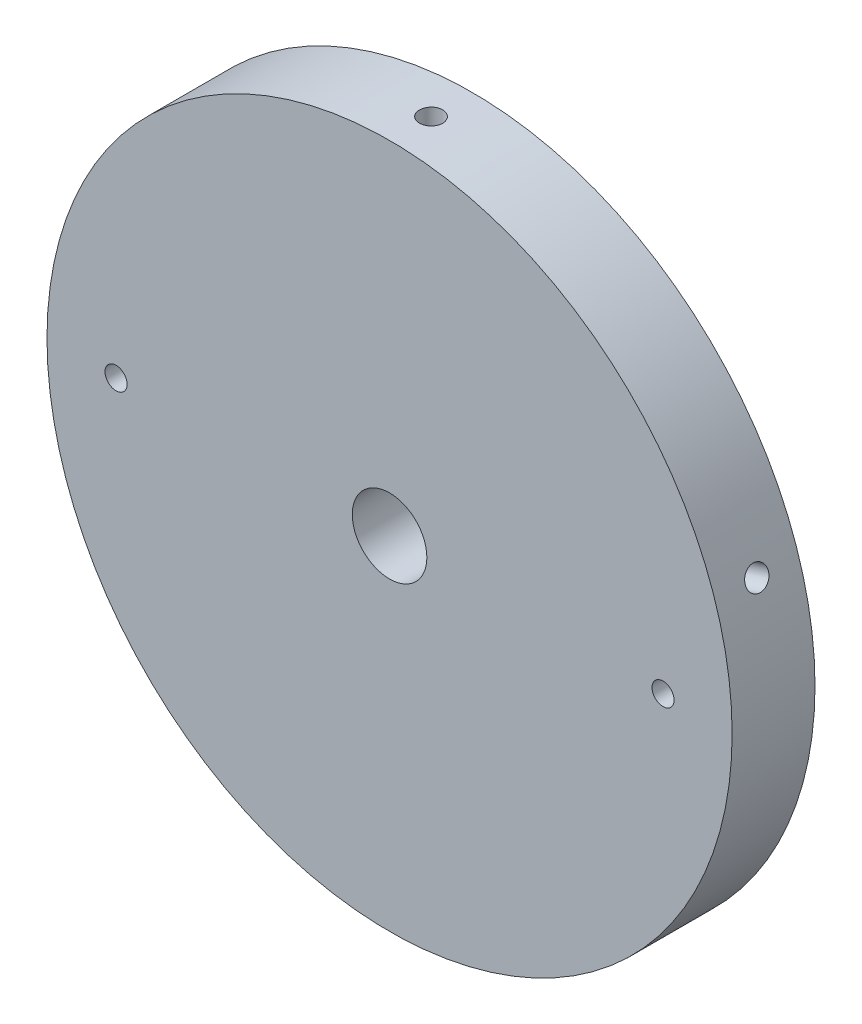
ISO-10303-21;
HEADER;
FILE_DESCRIPTION(('STEP AP214'),'2;1');
FILE_NAME('part.step','',(''),(''),'','','');
FILE_SCHEMA(('AUTOMOTIVE_DESIGN { 1 0 10303 214 1 1 1 1 }'));
ENDSEC;
DATA;
#1=APPLICATION_CONTEXT('core data for automotive mechanical design processes');
#2=APPLICATION_PROTOCOL_DEFINITION('international standard','automotive_design',2000,#1);
#3=PRODUCT_CONTEXT('',#1,'mechanical');
#4=PRODUCT('Part','Part','',(#3));
#5=PRODUCT_RELATED_PRODUCT_CATEGORY('part','',(#4));
#6=PRODUCT_DEFINITION_FORMATION('','',#4);
#7=PRODUCT_DEFINITION_CONTEXT('part definition',#1,'design');
#8=PRODUCT_DEFINITION('design','',#6,#7);
#9=PRODUCT_DEFINITION_SHAPE('','',#8);
#10=(LENGTH_UNIT() NAMED_UNIT(*) SI_UNIT(.MILLI.,.METRE.));
#11=(NAMED_UNIT(*) PLANE_ANGLE_UNIT() SI_UNIT($,.RADIAN.));
#12=(NAMED_UNIT(*) SI_UNIT($,.STERADIAN.) SOLID_ANGLE_UNIT());
#13=UNCERTAINTY_MEASURE_WITH_UNIT(LENGTH_MEASURE(1.E-05),#10,'distance_accuracy_value','');
#14=(GEOMETRIC_REPRESENTATION_CONTEXT(3) GLOBAL_UNCERTAINTY_ASSIGNED_CONTEXT((#13)) GLOBAL_UNIT_ASSIGNED_CONTEXT((#10,
#11,#12)) REPRESENTATION_CONTEXT('',''));
#15=CARTESIAN_POINT('',(0.,0.,0.));
#16=DIRECTION('',(0.,0.,1.));
#17=DIRECTION('',(1.,0.,0.));
#18=AXIS2_PLACEMENT_3D('',#15,#16,#17);
#19=CARTESIAN_POINT('',(0.,0.,0.));
#20=DIRECTION('',(0.,0.,1.));
#21=DIRECTION('',(1.,0.,0.));
#22=AXIS2_PLACEMENT_3D('',#19,#20,#21);
#23=PLANE('',#22);
#24=CARTESIAN_POINT('',(49.5,0.,0.));
#25=DIRECTION('',(0.,0.,-1.));
#26=DIRECTION('',(-1.,0.,0.));
#27=AXIS2_PLACEMENT_3D('',#24,#25,#26);
#28=CIRCLE('',#27,2.);
#29=CARTESIAN_POINT('',(47.5,0.,0.));
#30=VERTEX_POINT('',#29);
#31=EDGE_CURVE('E151',#30,#30,#28,.T.);
#32=ORIENTED_EDGE('',*,*,#31,.F.);
#33=EDGE_LOOP('',(#32));
#34=FACE_BOUND('',#33,.T.);
#35=CARTESIAN_POINT('',(-49.5,0.,0.));
#36=DIRECTION('',(0.,0.,-1.));
#37=DIRECTION('',(1.,0.,0.));
#38=AXIS2_PLACEMENT_3D('',#35,#36,#37);
#39=CIRCLE('',#38,2.);
#40=CARTESIAN_POINT('',(-47.5,0.,0.));
#41=VERTEX_POINT('',#40);
#42=EDGE_CURVE('E88',#41,#41,#39,.T.);
#43=ORIENTED_EDGE('',*,*,#42,.F.);
#44=EDGE_LOOP('',(#43));
#45=FACE_BOUND('',#44,.T.);
#46=CARTESIAN_POINT('',(0.,0.,0.));
#47=DIRECTION('',(0.,0.,1.));
#48=DIRECTION('',(1.,0.,0.));
#49=AXIS2_PLACEMENT_3D('',#46,#47,#48);
#50=CIRCLE('',#49,62.);
#51=CARTESIAN_POINT('',(62.,0.,0.));
#52=VERTEX_POINT('',#51);
#53=EDGE_CURVE('E105',#52,#52,#50,.T.);
#54=ORIENTED_EDGE('',*,*,#53,.F.);
#55=EDGE_LOOP('',(#54));
#56=FACE_BOUND('',#55,.T.);
#57=CARTESIAN_POINT('',(0.,0.,0.));
#58=DIRECTION('',(0.,0.,-1.));
#59=DIRECTION('',(-1.,0.,0.));
#60=AXIS2_PLACEMENT_3D('',#57,#58,#59);
#61=CIRCLE('',#60,6.75);
#62=CARTESIAN_POINT('',(-6.75,0.,0.));
#63=VERTEX_POINT('',#62);
#64=EDGE_CURVE('E99',#63,#63,#61,.T.);
#65=ORIENTED_EDGE('',*,*,#64,.F.);
#66=EDGE_LOOP('',(#65));
#67=FACE_BOUND('',#66,.T.);
#68=ADVANCED_FACE('F43',(#34,#45,#56,#67),#23,.F.);
#69=CARTESIAN_POINT('',(0.,0.,15.));
#70=DIRECTION('',(0.,0.,-1.));
#71=DIRECTION('',(-1.,0.,0.));
#72=AXIS2_PLACEMENT_3D('',#69,#70,#71);
#73=CYLINDRICAL_SURFACE('',#72,62.);
#74=CARTESIAN_POINT('',(0.,62.,9.59999999999999));
#75=CARTESIAN_POINT('',(-0.117921638843177,61.9999995213604,9.5999947818121));
#76=CARTESIAN_POINT('',(-0.235927920803326,61.999659968179,9.59003414813732));
#77=CARTESIAN_POINT('',(-0.468688041985538,61.9983380658244,9.55043882006453));
#78=CARTESIAN_POINT('',(-0.583437834106351,61.9973549504634,9.52078067433379));
#79=CARTESIAN_POINT('',(-0.806279343525078,61.9948572492048,9.44263782182455));
#80=CARTESIAN_POINT('',(-0.914374308653767,61.9933429250153,9.39416238441721));
#81=CARTESIAN_POINT('',(-1.12086235079248,61.9899535779122,9.27977443318435));
#82=CARTESIAN_POINT('',(-1.21925777611183,61.9880786426304,9.21386615424374));
#83=CARTESIAN_POINT('',(-1.40363707403613,61.9841780224041,9.06644215555477));
#84=CARTESIAN_POINT('',(-1.48961518388586,61.9821522681226,8.9849192297663));
#85=CARTESIAN_POINT('',(-1.6466705919053,61.9781789332386,8.80859317088848));
#86=CARTESIAN_POINT('',(-1.71774729431084,61.9762313557641,8.71378950708265));
#87=CARTESIAN_POINT('',(-1.84299328340051,61.9726336109841,8.51356913913129));
#88=CARTESIAN_POINT('',(-1.89715881082167,61.9709835098405,8.4081500821192));
#89=CARTESIAN_POINT('',(-1.98702054197013,61.9681674908475,8.18970809536292));
#90=CARTESIAN_POINT('',(-2.02271682996355,61.9670015707891,8.07668520031399));
#91=CARTESIAN_POINT('',(-2.07461358753318,61.9652859230046,7.84629012543934));
#92=CARTESIAN_POINT('',(-2.09082159308871,61.9647359570991,7.7289196449037));
#93=CARTESIAN_POINT('',(-2.10330492447182,61.9643135138669,7.49312259138551));
#94=CARTESIAN_POINT('',(-2.09958034187077,61.9644410334277,7.37469602325717));
#95=CARTESIAN_POINT('',(-2.07231056848069,61.9653589592917,7.14019962259281));
#96=CARTESIAN_POINT('',(-2.04877352065729,61.9661490932585,7.02412884189152));
#97=CARTESIAN_POINT('',(-1.98255954836,61.9683027500695,6.79758694509029));
#98=CARTESIAN_POINT('',(-1.93988257574568,61.9696662743558,6.68711584307534));
#99=CARTESIAN_POINT('',(-1.83659085738082,61.9728133216384,6.47488295738543));
#100=CARTESIAN_POINT('',(-1.77597238220022,61.9745969319405,6.3731229901354));
#101=CARTESIAN_POINT('',(-1.63852115348181,61.9783829995984,6.18122088219945));
#102=CARTESIAN_POINT('',(-1.56168835092878,61.9803854576158,6.09107877663516));
#103=CARTESIAN_POINT('',(-1.3939434252765,61.9843847022495,5.92492376911918));
#104=CARTESIAN_POINT('',(-1.30302424328997,61.9863814855085,5.84891799333654));
#105=CARTESIAN_POINT('',(-1.10971230941487,61.990143317916,5.71324804801423));
#106=CARTESIAN_POINT('',(-1.00731955554447,61.9919083670245,5.65358388129726));
#107=CARTESIAN_POINT('',(-0.793963046459487,61.9950078015268,5.55229158361979));
#108=CARTESIAN_POINT('',(-0.682999182955421,61.9963421814784,5.51066368057776));
#109=CARTESIAN_POINT('',(-0.455652114139149,61.998429777767,5.44663014365018));
#110=CARTESIAN_POINT('',(-0.339268927567784,61.9991829961136,5.42422444329654));
#111=CARTESIAN_POINT('',(-0.104448827683682,62.0000231084437,5.39928006920672));
#112=CARTESIAN_POINT('',(0.0139870371150527,62.0001103331172,5.39673153565394));
#113=CARTESIAN_POINT('',(0.24960490595478,61.9996095024035,5.41154813880565));
#114=CARTESIAN_POINT('',(0.366786911864012,61.9990214480225,5.42891324583479));
#115=CARTESIAN_POINT('',(0.596543175381122,61.9972365404352,5.48305603709448));
#116=CARTESIAN_POINT('',(0.709118490068631,61.9960398277515,5.51982924060221));
#117=CARTESIAN_POINT('',(0.926498235213011,61.9931724365872,5.61173982063472));
#118=CARTESIAN_POINT('',(1.03130264552946,61.9915017568784,5.66687724475337));
#119=CARTESIAN_POINT('',(1.23021092949983,61.9878737713262,5.79397648077188));
#120=CARTESIAN_POINT('',(1.32431056347343,61.9859163526157,5.86594492443634));
#121=CARTESIAN_POINT('',(1.49909556023527,61.9819358425003,6.02465354784092));
#122=CARTESIAN_POINT('',(1.57978088078199,61.9799127508887,6.11139377409547));
#123=CARTESIAN_POINT('',(1.72547985505091,61.9760280163144,6.29722600093044));
#124=CARTESIAN_POINT('',(1.79048714424541,61.9741664391145,6.3963229930829));
#125=CARTESIAN_POINT('',(1.90294123050742,61.9708156572043,6.60403032798331));
#126=CARTESIAN_POINT('',(1.95038807286964,61.9693264515335,6.71264064619208));
#127=CARTESIAN_POINT('',(2.02636327638483,61.9668887912347,6.93626768153819));
#128=CARTESIAN_POINT('',(2.05489574616196,61.9659402191752,7.051283001478));
#129=CARTESIAN_POINT('',(2.0922457348708,61.9646904479775,7.2844749219433));
#130=CARTESIAN_POINT('',(2.101063285721,61.9643892477912,7.40265151735038));
#131=CARTESIAN_POINT('',(2.09873267374495,61.9644682225303,7.63874778585367));
#132=CARTESIAN_POINT('',(2.08759454146876,61.9648480551406,7.75666755821307));
#133=CARTESIAN_POINT('',(2.04568938591927,61.9662455573744,7.98896236044344));
#134=CARTESIAN_POINT('',(2.0149223239251,61.9672632282561,8.10333738332143));
#135=CARTESIAN_POINT('',(1.93463425431318,61.9698216286783,8.32529932182868));
#136=CARTESIAN_POINT('',(1.88511295128779,61.9713623664579,8.43288613050216));
#137=CARTESIAN_POINT('',(1.76872500982242,61.9747931535038,8.63821699439961));
#138=CARTESIAN_POINT('',(1.70185898390358,61.9766831904341,8.73596139703457));
#139=CARTESIAN_POINT('',(1.55264799409704,61.9806005177797,8.91888028052315));
#140=CARTESIAN_POINT('',(1.47029691377954,61.9826278622268,9.00404977060956));
#141=CARTESIAN_POINT('',(1.29244113443124,61.9865912144008,9.1593785084427));
#142=CARTESIAN_POINT('',(1.19693318674798,61.9885271994105,9.22953403803067));
#143=CARTESIAN_POINT('',(0.995431673904363,61.992090383797,9.35285850511048));
#144=CARTESIAN_POINT('',(0.889430860949572,61.9937173674393,9.40601559243468));
#145=CARTESIAN_POINT('',(0.670085090901752,61.996475430691,9.49371645627419));
#146=CARTESIAN_POINT('',(0.556749059930318,61.9976071004849,9.52828239613045));
#147=CARTESIAN_POINT('',(0.368915744265125,61.9989450479958,9.56867390266383));
#148=CARTESIAN_POINT('',(0.29563727005533,61.9993389350736,9.58040637459611));
#149=CARTESIAN_POINT('',(0.148250350513408,61.9998665614962,9.59607106222858));
#150=CARTESIAN_POINT('',(0.0741419054949903,62.0000003009393,9.600003280877));
#151=CARTESIAN_POINT('',(0.,62.,9.59999999999999));
#152=B_SPLINE_CURVE_WITH_KNOTS('',3,(#74,#75,#76,#77,#78,#79,#80,#81,#82,#83,#84,#85,#86,#87,
#88,#89,#90,#91,#92,#93,#94,#95,#96,#97,#98,#99,#100,#101,#102,#103,#104,#105,#106,#107,#108,
#109,#110,#111,#112,#113,#114,#115,#116,#117,#118,#119,#120,#121,#122,#123,#124,#125,#126,#127,
#128,#129,#130,#131,#132,#133,#134,#135,#136,#137,#138,#139,#140,#141,#142,#143,#144,#145,#146,
#147,#148,#149,#150,#151),.UNSPECIFIED.,.T.,.F.,(4,2,2,2,2,2,2,2,2,2,2,2,2,2,2,2,2,2,2,2,2,2,2,
2,2,2,2,2,2,2,2,2,2,2,2,2,2,2,4),(0.,0.353494286184042,0.707410189497763,1.06115197512235,
1.41480790658052,1.7686274425093,2.12246112158678,2.47637340007198,2.83028406381408,
3.18405782877756,3.53782996848703,3.89145677804414,4.24508447704261,4.5987857349363,
4.95248806206921,5.30636821125197,5.66024842156057,6.01413310360937,6.36801656196215,
6.72172429290466,7.07543149675183,7.42905707635964,7.78268357245286,8.13644964004535,
8.49021682162189,8.84412737485631,9.19803701522176,9.55186975329584,9.90570191851384,
10.2593562829727,10.6130113450676,10.9666719779961,11.3203201232576,11.6741082502777,
12.0279838906567,12.3821056941549,12.7358043921284,12.9580600368292,13.1803155975252),.UNSPECIFIED.);
#153=CARTESIAN_POINT('',(0.,62.,9.59999999999999));
#154=VERTEX_POINT('',#153);
#155=EDGE_CURVE('E11',#154,#154,#152,.T.);
#156=ORIENTED_EDGE('',*,*,#155,.T.);
#157=EDGE_LOOP('',(#156));
#158=FACE_BOUND('',#157,.T.);
#159=CARTESIAN_POINT('',(58.2827347506866,21.1452791417165,7.5));
#160=CARTESIAN_POINT('',(58.2827368194082,21.1452743271365,7.38207838303808));
#161=CARTESIAN_POINT('',(58.2861379479593,21.135906194509,7.2640721228838));
#162=CARTESIAN_POINT('',(58.2996314558306,21.0986575255358,7.03131204701029));
#163=CARTESIAN_POINT('',(58.3097318110809,21.0707549224589,6.91656227840935));
#164=CARTESIAN_POINT('',(58.3362557876745,20.9972088637673,6.69372081870509));
#165=CARTESIAN_POINT('',(58.3526762954945,20.9515741434951,6.58562587957173));
#166=CARTESIAN_POINT('',(58.3912485389359,20.84383247329,6.37913788091219));
#167=CARTESIAN_POINT('',(58.4133988826229,20.7817295238505,6.28074247310971));
#168=CARTESIAN_POINT('',(58.462665571742,20.6427265093339,6.09636315509181));
#169=CARTESIAN_POINT('',(58.489784211986,20.5658196056065,6.01038501325503));
#170=CARTESIAN_POINT('',(58.5480505866005,20.3993512798066,5.85332954358938));
#171=CARTESIAN_POINT('',(58.5791984819551,20.309789352104,5.78225281142674));
#172=CARTESIAN_POINT('',(58.6444907848177,20.1204799356563,5.65700679146425));
#173=CARTESIAN_POINT('',(58.6786358554483,20.0207301920629,5.60284125739397));
#174=CARTESIAN_POINT('',(58.7488152402606,19.8138493735322,5.51297951221824));
#175=CARTESIAN_POINT('',(58.7848495458301,19.7067183322424,5.4772832169276));
#176=CARTESIAN_POINT('',(58.8576763664361,19.4881295050607,5.42538644374749));
#177=CARTESIAN_POINT('',(58.8944685827715,19.3766734089749,5.40917842936448));
#178=CARTESIAN_POINT('',(58.967735410245,19.1525475785904,5.39669507548938));
#179=CARTESIAN_POINT('',(59.00421002284,19.0398778498638,5.40041964451872));
#180=CARTESIAN_POINT('',(59.0758009027608,18.8165749661226,5.42768939668605));
#181=CARTESIAN_POINT('',(59.1109177210264,18.7059409948335,5.45122645051302));
#182=CARTESIAN_POINT('',(59.178875799448,18.4898215176524,5.51744045996475));
#183=CARTESIAN_POINT('',(59.2117170538961,18.3843360246747,5.56011746359647));
#184=CARTESIAN_POINT('',(59.2743086848965,18.1815183292467,5.66340924563581));
#185=CARTESIAN_POINT('',(59.3040584183567,18.0841878239931,5.72402774614592));
#186=CARTESIAN_POINT('',(59.3597593372256,17.9005083075169,5.86147902863226));
#187=CARTESIAN_POINT('',(59.3857105111473,17.8141593295035,5.93831185964005));
#188=CARTESIAN_POINT('',(59.4332516936545,17.6549007171426,6.10605680515355));
#189=CARTESIAN_POINT('',(59.4548395049152,17.5819978556688,6.19697597282076));
#190=CARTESIAN_POINT('',(59.4931853934036,17.4518054320561,6.39028786613167));
#191=CARTESIAN_POINT('',(59.509943469777,17.3945158726785,6.49268059380452));
#192=CARTESIAN_POINT('',(59.5382956997291,17.2972230667349,6.70603709648558));
#193=CARTESIAN_POINT('',(59.549889785581,17.2572200468857,6.81700098388393));
#194=CARTESIAN_POINT('',(59.5676908409679,17.1956751246031,7.0443481045321));
#195=CARTESIAN_POINT('',(59.5738978291703,17.1741331581983,7.16073131900135));
#196=CARTESIAN_POINT('',(59.5808066140784,17.1501499230049,7.3955514307539));
#197=CARTESIAN_POINT('',(59.5815111450675,17.1476991674053,7.51398727871313));
#198=CARTESIAN_POINT('',(59.577409145883,17.1619454695854,7.74960511038528));
#199=CARTESIAN_POINT('',(59.5726026239215,17.1786424988328,7.86678709596635));
#200=CARTESIAN_POINT('',(59.5575700012293,17.2306871997438,8.0965432639664));
#201=CARTESIAN_POINT('',(59.5473451537867,17.266030558402,8.20911850546627));
#202=CARTESIAN_POINT('',(59.5216713813212,17.35432907838,8.42649811325797));
#203=CARTESIAN_POINT('',(59.5062224427254,17.4072842854574,8.5313024593592));
#204=CARTESIAN_POINT('',(59.4703978879344,17.5292841591179,8.73021070128965));
#205=CARTESIAN_POINT('',(59.450020326319,17.5983351786298,8.82431035015485));
#206=CARTESIAN_POINT('',(59.4047625664254,17.7505061535824,8.99909538105664));
#207=CARTESIAN_POINT('',(59.3798823539901,17.8336261532582,9.07978072091491));
#208=CARTESIAN_POINT('',(59.326151132526,18.0115633968917,9.22547973447824));
#209=CARTESIAN_POINT('',(59.2972985183306,18.1063853677635,9.29048704364257));
#210=CARTESIAN_POINT('',(59.2362991999721,18.3049619289299,9.40294116499637));
#211=CARTESIAN_POINT('',(59.2041525043058,18.4087164961832,9.45038802248058));
#212=CARTESIAN_POINT('',(59.1373652525934,18.6221513710244,9.52636323654938));
#213=CARTESIAN_POINT('',(59.1027252408317,18.7318303840246,9.55489570829372));
#214=CARTESIAN_POINT('',(59.0318529486807,18.9539950147453,9.59224571029965));
#215=CARTESIAN_POINT('',(58.9956206708577,19.0664806279424,9.60106327233382));
#216=CARTESIAN_POINT('',(58.9225878396488,19.2909971524818,9.59873269193633));
#217=CARTESIAN_POINT('',(58.8857875805681,19.4030282636811,9.58759456677552));
#218=CARTESIAN_POINT('',(58.8126761166616,19.6235222284199,9.54568940731513));
#219=CARTESIAN_POINT('',(58.7763649127982,19.7319850749369,9.5149223343872));
#220=CARTESIAN_POINT('',(58.7053427572142,19.9422932794088,9.43463422401624));
#221=CARTESIAN_POINT('',(58.6706318307055,20.0441385331163,9.38511289121988));
#222=CARTESIAN_POINT('',(58.6039191638604,20.238360011903,9.2687248749142));
#223=CARTESIAN_POINT('',(58.5719173278984,20.3307365712332,9.20185880397944));
#224=CARTESIAN_POINT('',(58.5116671145131,20.5034923810922,9.05264776582188));
#225=CARTESIAN_POINT('',(58.4834202253085,20.5838668763238,8.97029669237936));
#226=CARTESIAN_POINT('',(58.4316513640674,20.7303683854052,8.7924409405443));
#227=CARTESIAN_POINT('',(58.4081305625467,20.7964918699838,8.69693301342646));
#228=CARTESIAN_POINT('',(58.3666315433318,20.9126790056786,8.49543151614507));
#229=CARTESIAN_POINT('',(58.3486571945112,20.962731447579,8.38943069453402));
#230=CARTESIAN_POINT('',(58.3189319792214,21.0452872686083,8.17008490590309));
#231=CARTESIAN_POINT('',(58.3071737025436,21.0778115440492,8.0567488650521));
#232=CARTESIAN_POINT('',(58.2934189190045,21.1158124613661,7.86891557209974));
#233=CARTESIAN_POINT('',(58.2894185731767,21.1268489096239,7.79563713222075));
#234=CARTESIAN_POINT('',(58.2840758391785,21.1415837619657,7.64825028151418));
#235=CARTESIAN_POINT('',(58.2827334500015,21.1452821688287,7.57414187100092));
#236=CARTESIAN_POINT('',(58.2827347506866,21.1452791417165,7.5));
#237=B_SPLINE_CURVE_WITH_KNOTS('',3,(#159,#160,#161,#162,#163,#164,#165,#166,#167,#168,#169,
#170,#171,#172,#173,#174,#175,#176,#177,#178,#179,#180,#181,#182,#183,#184,#185,#186,#187,#188,
#189,#190,#191,#192,#193,#194,#195,#196,#197,#198,#199,#200,#201,#202,#203,#204,#205,#206,#207,
#208,#209,#210,#211,#212,#213,#214,#215,#216,#217,#218,#219,#220,#221,#222,#223,#224,#225,#226,
#227,#228,#229,#230,#231,#232,#233,#234,#235,#236),.UNSPECIFIED.,.T.,.F.,(4,2,2,2,2,2,2,2,2,2,2,
2,2,2,2,2,2,2,2,2,2,2,2,2,2,2,2,2,2,2,2,2,2,2,2,2,2,2,4),(0.,0.353494220471821,
0.707410059501999,1.06115177017179,1.41480762782904,1.76862724971208,2.12246101242037,
2.47637325883656,2.83028389206086,3.18405761716328,3.5378297186583,3.89145673373903,
4.24508463579454,4.59878595218127,4.95248833816355,5.30636840205837,5.66024852853804,
6.01413329609242,6.36801683735855,6.72172451546856,7.07543166651429,7.42905703886852,
7.78268332999195,8.13644943251428,8.49021664735437,8.84412723416447,9.19803690810505,
9.55186955743167,9.90570163652049,10.2593561502498,10.6130113599478,10.9666721394517,
11.3203204302052,11.6741084690826,12.0279840233538,12.3821058649446,12.7358045988328,
12.9580601402169,13.1803155974352),.UNSPECIFIED.);
#238=CARTESIAN_POINT('',(58.2827347506866,21.1452791417165,7.5));
#239=VERTEX_POINT('',#238);
#240=EDGE_CURVE('E53',#239,#239,#237,.T.);
#241=ORIENTED_EDGE('',*,*,#240,.T.);
#242=EDGE_LOOP('',(#241));
#243=FACE_BOUND('',#242,.T.);
#244=CARTESIAN_POINT('',(38.120711033219,-48.89592406655,7.5));
#245=CARTESIAN_POINT('',(38.1207070935514,-48.8959275218082,7.38207838303808));
#246=CARTESIAN_POINT('',(38.1128484764928,-48.9020570994669,7.2640721228838));
#247=CARTESIAN_POINT('',(38.0815926103886,-48.9264006597862,7.03131204701029));
#248=CARTESIAN_POINT('',(38.0581768393322,-48.9446290470019,6.91656227840935));
#249=CARTESIAN_POINT('',(37.9964267404916,-48.9925818297843,6.69372081870509));
#250=CARTESIAN_POINT('',(37.9580997583801,-49.022300564845,6.58562587957174));
#251=CARTESIAN_POINT('',(37.8675508195895,-49.0922789554139,6.37913788091219));
#252=CARTESIAN_POINT('',(37.8153322374745,-49.1325360508932,6.28074247310971));
#253=CARTESIAN_POINT('',(37.6983567589282,-49.2223457503711,6.09636315509181));
#254=CARTESIAN_POINT('',(37.6335940676899,-49.2719026501248,6.01038501325503));
#255=CARTESIAN_POINT('',(37.4932785816376,-49.3787588070801,5.85332954358938));
#256=CARTESIAN_POINT('',(37.4177253556877,-49.4360583736351,5.78225281142674));
#257=CARTESIAN_POINT('',(37.2578578327655,-49.556654870614,5.65700679146425));
#258=CARTESIAN_POINT('',(37.1735415962212,-49.6199531284915,5.60284125739397));
#259=CARTESIAN_POINT('',(36.9984728682229,-49.750627378463,5.51297951221824));
#260=CARTESIAN_POINT('',(36.9077204061082,-49.8180033519687,5.4772832169276));
#261=CARTESIAN_POINT('',(36.7223348028413,-49.9548134366467,5.42538644374748));
#262=CARTESIAN_POINT('',(36.6277031764864,-50.0242467415586,5.40917842936448));
#263=CARTESIAN_POINT('',(36.4371875398424,-50.1631863257228,5.39669507548938));
#264=CARTESIAN_POINT('',(36.3413035353029,-50.2326926046387,5.40041964451872));
#265=CARTESIAN_POINT('',(36.1510526711511,-50.3697839634636,5.42768939668605));
#266=CARTESIAN_POINT('',(36.0566852054654,-50.4373698195902,5.45122645051302));
#267=CARTESIAN_POINT('',(35.8721435695314,-50.5687863841724,5.51744045996475));
#268=CARTESIAN_POINT('',(35.7819694098014,-50.6326170832087,5.56011746359647));
#269=CARTESIAN_POINT('',(35.6084201966294,-50.7548193763843,5.66340924563581));
#270=CARTESIAN_POINT('',(35.525046558591,-50.8131898344442,5.72402774614593));
#271=CARTESIAN_POINT('',(35.3675694880692,-50.9229246484078,5.86147902863226));
#272=CARTESIAN_POINT('',(35.2934660836199,-50.9742889831246,5.93831185964005));
#273=CARTESIAN_POINT('',(35.1566931758853,-51.0687169522605,6.10605680515355));
#274=CARTESIAN_POINT('',(35.094029434975,-51.1117764039666,6.19697597282075));
#275=CARTESIAN_POINT('',(34.9820586133332,-51.1884771825218,6.39028786613167));
#276=CARTESIAN_POINT('',(34.9327515349639,-51.2221185077052,6.49268059380452));
#277=CARTESIAN_POINT('',(34.8489818987663,-51.2791482112196,6.70603709648558));
#278=CARTESIAN_POINT('',(34.8145195356297,-51.3025364550793,6.81700098388393));
#279=CARTESIAN_POINT('',(34.7614876648803,-51.3384846917048,7.0443481045321));
#280=CARTESIAN_POINT('',(34.7429181021956,-51.3510447219926,7.16073131900135));
#281=CARTESIAN_POINT('',(34.7222436220302,-51.3650265941539,7.3955514307539));
#282=CARTESIAN_POINT('',(34.720130526996,-51.3664539680714,7.51398727871312));
#283=CARTESIAN_POINT('',(34.7324119780586,-51.3581503855364,7.74960511038528));
#284=CARTESIAN_POINT('',(34.7468064995571,-51.3484194457112,7.86678709596635));
#285=CARTESIAN_POINT('',(34.7916586156152,-51.3180398748942,8.0965432639664));
#286=CARTESIAN_POINT('',(34.8221124955502,-51.2973937686421,8.20911850546627));
#287=CARTESIAN_POINT('',(34.8981557463529,-51.2456908167895,8.42649811325797));
#288=CARTESIAN_POINT('',(34.9437451565446,-51.2146339441406,8.53130245935919));
#289=CARTESIAN_POINT('',(35.0487035351303,-51.1428627335906,8.73021070128965));
#290=CARTESIAN_POINT('',(35.1080779443507,-51.1021445823219,8.82431035015484));
#291=CARTESIAN_POINT('',(35.2388157247359,-51.0120784775512,8.99909538105663));
#292=CARTESIAN_POINT('',(35.3101791335959,-50.9627304969156,9.07978072091491));
#293=CARTESIAN_POINT('',(35.4628036480842,-50.8566434363987,9.22547973447824));
#294=CARTESIAN_POINT('',(35.5440687532513,-50.7999013692165,9.29048704364257));
#295=CARTESIAN_POINT('',(35.714076459714,-50.680524037917,9.40294116499637));
#296=CARTESIAN_POINT('',(35.8028190417217,-50.617888789001,9.45038802248059));
#297=CARTESIAN_POINT('',(35.9851692744574,-50.4884153345362,9.52636323654938));
#298=CARTESIAN_POINT('',(36.0787758621523,-50.4215780466824,9.55489570829372));
#299=CARTESIAN_POINT('',(36.2681662391846,-50.2855218449657,9.59224571029965));
#300=CARTESIAN_POINT('',(36.363950025013,-50.2163029349413,9.60106327233382));
#301=CARTESIAN_POINT('',(36.5549095427012,-50.0774651633159,9.59873269193633));
#302=CARTESIAN_POINT('',(36.6500855555818,-50.0078465198567,9.58759456677552));
#303=CARTESIAN_POINT('',(36.8371950927196,-49.870177003431,9.54568940731512));
#304=CARTESIAN_POINT('',(36.9291286105955,-49.8021261335502,9.5149223343872));
#305=CARTESIAN_POINT('',(37.1071965458362,-49.6695912404425,9.43463422401624));
#306=CARTESIAN_POINT('',(37.1933308718468,-49.6051072734076,9.38511289121988));
#307=CARTESIAN_POINT('',(37.3574311270562,-49.4816420192675,9.2687248749142));
#308=CARTESIAN_POINT('',(37.4353973445966,-49.4226605379275,9.20185880397944));
#309=CARTESIAN_POINT('',(37.5810795434401,-49.3119746987558,9.05264776582188));
#310=CARTESIAN_POINT('',(37.6487914620716,-49.2602732257718,8.97029669237936));
#311=CARTESIAN_POINT('',(37.7721252190276,-49.1657666569396,8.7924409405443));
#312=CARTESIAN_POINT('',(37.827744062525,-49.1229637649227,8.69693301342646));
#313=CARTESIAN_POINT('',(37.9254206928499,-49.0475920528211,8.49543151614507));
#314=CARTESIAN_POINT('',(37.9674690146274,-49.0150303760919,8.38943069453402));
#315=CARTESIAN_POINT('',(38.0367986694894,-48.9612488647096,8.1700849059031));
#316=CARTESIAN_POINT('',(38.0640975862672,-48.9400155252138,8.0567488650521));
#317=CARTESIAN_POINT('',(38.0959881444391,-48.9151910194459,7.86891557209974));
#318=CARTESIAN_POINT('',(38.1052482556273,-48.9079760144098,7.79563713222075));
#319=CARTESIAN_POINT('',(38.1176109373618,-48.8983414526427,7.64825028151418));
#320=CARTESIAN_POINT('',(38.1207135102399,-48.8959218940958,7.57414187100092));
#321=CARTESIAN_POINT('',(38.120711033219,-48.89592406655,7.5));
#322=B_SPLINE_CURVE_WITH_KNOTS('',3,(#244,#245,#246,#247,#248,#249,#250,#251,#252,#253,#254,
#255,#256,#257,#258,#259,#260,#261,#262,#263,#264,#265,#266,#267,#268,#269,#270,#271,#272,#273,
#274,#275,#276,#277,#278,#279,#280,#281,#282,#283,#284,#285,#286,#287,#288,#289,#290,#291,#292,
#293,#294,#295,#296,#297,#298,#299,#300,#301,#302,#303,#304,#305,#306,#307,#308,#309,#310,#311,
#312,#313,#314,#315,#316,#317,#318,#319,#320,#321),.UNSPECIFIED.,.T.,.F.,(4,2,2,2,2,2,2,2,2,2,2,
2,2,2,2,2,2,2,2,2,2,2,2,2,2,2,2,2,2,2,2,2,2,2,2,2,2,2,4),(0.,0.353494220471821,
0.707410059501997,1.06115177017179,1.41480762782904,1.76862724971207,2.12246101242037,
2.47637325883656,2.83028389206085,3.18405761716329,3.5378297186583,3.89145673373903,
4.24508463579455,4.59878595218127,4.95248833816355,5.30636840205837,5.66024852853804,
6.01413329609242,6.36801683735855,6.72172451546856,7.07543166651428,7.42905703886851,
7.78268332999195,8.13644943251428,8.49021664735436,8.84412723416448,9.19803690810506,
9.55186955743167,9.90570163652049,10.2593561502498,10.6130113599478,10.9666721394517,
11.3203204302052,11.6741084690826,12.0279840233538,12.3821058649446,12.7358045988328,
12.9580601402169,13.1803155974352),.UNSPECIFIED.);
#323=CARTESIAN_POINT('',(38.120711033219,-48.89592406655,7.5));
#324=VERTEX_POINT('',#323);
#325=EDGE_CURVE('E198',#324,#324,#322,.T.);
#326=ORIENTED_EDGE('',*,*,#325,.T.);
#327=EDGE_LOOP('',(#326));
#328=FACE_BOUND('',#327,.T.);
#329=CARTESIAN_POINT('',(-34.7228396568442,-51.3646221261783,7.5));
#330=CARTESIAN_POINT('',(-34.7228441604142,-51.3646194470654,7.38207838303808));
#331=CARTESIAN_POINT('',(-34.7311021814121,-51.3590396017676,7.2640721228838));
#332=CARTESIAN_POINT('',(-34.7639128768837,-51.336836080479,7.03131204701029));
#333=CARTESIAN_POINT('',(-34.7884849745195,-51.3201992402614,6.91656227840935));
#334=CARTESIAN_POINT('',(-34.8531726110053,-51.2762896311846,6.69372081870509));
#335=CARTESIAN_POINT('',(-34.8932804964564,-51.2490220992825,6.58562587957174));
#336=CARTESIAN_POINT('',(-34.9878150617157,-51.184529452927,6.37913788091219));
#337=CARTESIAN_POINT('',(-35.0422382639941,-51.147306756782,6.28074247310971));
#338=CARTESIAN_POINT('',(-35.163799774705,-51.0638091890622,6.09636315509181));
#339=CARTESIAN_POINT('',(-35.2309439593373,-51.0175301337597,6.01038501325503));
#340=CARTESIAN_POINT('',(-35.37593007348,-50.9171025448653,5.85332954358938));
#341=CARTESIAN_POINT('',(-35.4537724304314,-50.8629536968343,5.78225281142674));
#342=CARTESIAN_POINT('',(-35.6178682961572,-50.7481770144438,5.65700679146425));
#343=CARTESIAN_POINT('',(-35.7041236667756,-50.6875477456473,5.60284125739397));
#344=CARTESIAN_POINT('',(-35.882501475858,-50.5614280550534,5.51297951221824));
#345=CARTESIAN_POINT('',(-35.9746238875772,-50.4959376554152,5.4772832169276));
#346=CARTESIAN_POINT('',(-36.162025312027,-50.3619021105683,5.42538644374749));
#347=CARTESIAN_POINT('',(-36.2573030898604,-50.2933581568693,5.40917842936448));
#348=CARTESIAN_POINT('',(-36.4483150561682,-50.155101711881,5.39669507548938));
#349=CARTESIAN_POINT('',(-36.5440492425461,-50.085389225956,5.40041964451872));
#350=CARTESIAN_POINT('',(-36.7332216229017,-49.9468134615325,5.42768939668605));
#351=CARTESIAN_POINT('',(-36.8266607423933,-49.8779498464884,5.45122645051302));
#352=CARTESIAN_POINT('',(-37.0086718241616,-49.7430502729039,5.51744045996475));
#353=CARTESIAN_POINT('',(-37.0972437742298,-49.6770143214563,5.56011746359647));
#354=CARTESIAN_POINT('',(-37.2670947176913,-49.549721796714,5.66340924563581));
#355=CARTESIAN_POINT('',(-37.348372193225,-49.4884662184802,5.72402774614592));
#356=CARTESIAN_POINT('',(-37.5013992941251,-49.3726065467828,5.86147902863226));
#357=CARTESIAN_POINT('',(-37.5731488906786,-49.3180024734338,5.93831185964005));
#358=CARTESIAN_POINT('',(-37.7052203789059,-49.2171035554876,6.10605680515355));
#359=CARTESIAN_POINT('',(-37.7655365119114,-49.170812898705,6.19697597282075));
#360=CARTESIAN_POINT('',(-37.8730841739227,-49.088024163203,6.39028786613167));
#361=CARTESIAN_POINT('',(-37.9203157006143,-49.0515260862153,6.49268059380452));
#362=CARTESIAN_POINT('',(-38.0004404129617,-48.9894795754121,6.70603709648558));
#363=CARTESIAN_POINT('',(-38.0333334105647,-48.9639312852053,6.81700098388393));
#364=CARTESIAN_POINT('',(-38.0839099645617,-48.9246035949928,7.04434810453209));
#365=CARTESIAN_POINT('',(-38.1015935736595,-48.9108241542056,7.16073131900135));
#366=CARTESIAN_POINT('',(-38.1212798900095,-48.8954821912343,7.3955514307539));
#367=CARTESIAN_POINT('',(-38.1232903855512,-48.8939136012303,7.51398727871312));
#368=CARTESIAN_POINT('',(-38.1115980321788,-48.9030280071755,7.74960511038528));
#369=CARTESIAN_POINT('',(-38.0978952066794,-48.9137109848684,7.86678709596634));
#370=CARTESIAN_POINT('',(-38.055142451796,-48.9469800784508,8.0965432639664));
#371=CARTESIAN_POINT('',(-38.0260960714642,-48.9695634417099,8.20911850546627));
#372=CARTESIAN_POINT('',(-37.9534249853876,-49.0259077801242,8.42649811325797));
#373=CARTESIAN_POINT('',(-37.9098002417664,-49.0596687843204,8.53130245935919));
#374=CARTESIAN_POINT('',(-37.8091078416054,-49.1373116104473,8.73021070128964));
#375=CARTESIAN_POINT('',(-37.7520348770297,-49.181197428516,8.82431035015484));
#376=CARTESIAN_POINT('',(-37.6259767252443,-49.277704489486,8.99909538105663));
#377=CARTESIAN_POINT('',(-37.5569915005806,-49.3303257598529,9.07978072091491));
#378=CARTESIAN_POINT('',(-37.4089331416462,-49.4426975943203,9.22547973447824));
#379=CARTESIAN_POINT('',(-37.3298559303582,-49.5024510390816,9.29048704364257));
#380=CARTESIAN_POINT('',(-37.1637860710563,-49.6272483520187,9.40294116499637));
#381=CARTESIAN_POINT('',(-37.0767934434599,-49.6922922065481,9.45038802248058));
#382=CARTESIAN_POINT('',(-36.8973075500603,-49.8257080858893,9.52636323654938));
#383=CARTESIAN_POINT('',(-36.8048154855323,-49.8940793832798,9.55489570829372));
#384=CARTESIAN_POINT('',(-36.6168935032332,-50.0321566569594,9.59224571029965));
#385=CARTESIAN_POINT('',(-36.5214635901971,-50.1018626310973,9.60106327233382));
#386=CARTESIAN_POINT('',(-36.3304112865816,-50.2405726938499,9.59873269193633));
#387=CARTESIAN_POINT('',(-36.234789016627,-50.3095771171407,9.58759456677552));
#388=CARTESIAN_POINT('',(-36.04603749915,-50.4449866415137,9.54568940731512));
#389=CARTESIAN_POINT('',(-35.952908256534,-50.5113917374803,9.5149223343872));
#390=CARTESIAN_POINT('',(-35.7718340646648,-50.6397888733163,9.43463422401624));
#391=CARTESIAN_POINT('',(-35.6838891970834,-50.7017808436668,9.38511289121988));
#392=CARTESIAN_POINT('',(-35.5157569949564,-50.8196965989653,9.2687248749142));
#393=CARTESIAN_POINT('',(-35.4355693865802,-50.8756205981206,9.20185880397944));
#394=CARTESIAN_POINT('',(-35.2852826227538,-50.9799687972981,9.05264776582188));
#395=CARTESIAN_POINT('',(-35.2151874663914,-51.0283900249573,8.97029669237936));
#396=CARTESIAN_POINT('',(-35.0871941513913,-51.1164832623402,8.7924409405443));
#397=CARTESIAN_POINT('',(-35.0292990141743,-51.1561531048355,8.69693301342646));
#398=CARTESIAN_POINT('',(-34.927432517512,-51.2257579606613,8.49543151614507));
#399=CARTESIAN_POINT('',(-34.883470876663,-51.2556861796123,8.38943069453402));
#400=CARTESIAN_POINT('',(-34.8108975782402,-51.305003198641,8.1700849059031));
#401=CARTESIAN_POINT('',(-34.7822676431376,-51.3244045485789,8.0567488650521));
#402=CARTESIAN_POINT('',(-34.7488034107281,-51.3470630775773,7.86891557209975));
#403=CARTESIAN_POINT('',(-34.7390800014464,-51.3536404074938,7.79563713222075));
#404=CARTESIAN_POINT('',(-34.7260967099442,-51.3624207731969,7.64825028151418));
#405=CARTESIAN_POINT('',(-34.7228368252759,-51.36462381064,7.57414187100091));
#406=CARTESIAN_POINT('',(-34.7228396568442,-51.3646221261783,7.5));
#407=B_SPLINE_CURVE_WITH_KNOTS('',3,(#329,#330,#331,#332,#333,#334,#335,#336,#337,#338,#339,
#340,#341,#342,#343,#344,#345,#346,#347,#348,#349,#350,#351,#352,#353,#354,#355,#356,#357,#358,
#359,#360,#361,#362,#363,#364,#365,#366,#367,#368,#369,#370,#371,#372,#373,#374,#375,#376,#377,
#378,#379,#380,#381,#382,#383,#384,#385,#386,#387,#388,#389,#390,#391,#392,#393,#394,#395,#396,
#397,#398,#399,#400,#401,#402,#403,#404,#405,#406),.UNSPECIFIED.,.T.,.F.,(4,2,2,2,2,2,2,2,2,2,2,
2,2,2,2,2,2,2,2,2,2,2,2,2,2,2,2,2,2,2,2,2,2,2,2,2,2,2,4),(0.,0.353494220471821,
0.707410059501997,1.06115177017179,1.41480762782904,1.76862724971208,2.12246101242036,
2.47637325883656,2.83028389206085,3.18405761716329,3.5378297186583,3.89145673373903,
4.24508463579454,4.59878595218126,4.95248833816354,5.30636840205836,5.66024852853803,
6.01413329609242,6.36801683735855,6.72172451546856,7.07543166651428,7.42905703886851,
7.78268332999194,8.13644943251428,8.49021664735437,8.84412723416447,9.19803690810505,
9.55186955743168,9.90570163652049,10.2593561502498,10.6130113599478,10.9666721394517,
11.3203204302052,11.6741084690826,12.0279840233538,12.3821058649446,12.7358045988328,
12.9580601402169,13.1803155974352),.UNSPECIFIED.);
#408=CARTESIAN_POINT('',(-34.7228396568442,-51.3646221261783,7.5));
#409=VERTEX_POINT('',#408);
#410=EDGE_CURVE('E118',#409,#409,#407,.T.);
#411=ORIENTED_EDGE('',*,*,#410,.T.);
#412=EDGE_LOOP('',(#411));
#413=FACE_BOUND('',#412,.T.);
#414=CARTESIAN_POINT('',(-59.5806061270614,17.1508417732769,7.5));
#415=CARTESIAN_POINT('',(-59.5806049707532,17.150846884318,7.38207838303808));
#416=CARTESIAN_POINT('',(-59.5778500913511,17.1604249960227,7.2640721228838));
#417=CARTESIAN_POINT('',(-59.5668723502428,17.1984910871683,7.03131204701029));
#418=CARTESIAN_POINT('',(-59.5586429707003,17.2270016071038,6.91656227840935));
#419=CARTESIAN_POINT('',(-59.5368720298598,17.3020920207285,6.69372081870509));
#420=CARTESIAN_POINT('',(-59.5233330841739,17.3486630172939,6.58562587957174));
#421=CARTESIAN_POINT('',(-59.4912097198253,17.458500055335,6.37913788091219));
#422=CARTESIAN_POINT('',(-59.4726265264949,17.5217620421847,6.28074247310971));
#423=CARTESIAN_POINT('',(-59.4307801932918,17.6631760764915,6.09636315509181));
#424=CARTESIAN_POINT('',(-59.4075148903031,17.7413350053894,6.01038501325503));
#425=CARTESIAN_POINT('',(-59.3568057506878,17.9102588256896,5.85332954358938));
#426=CARTESIAN_POINT('',(-59.3293617470982,18.0010242207794,5.78225281142674));
#427=CARTESIAN_POINT('',(-59.2709110466079,18.1925566085916,5.65700679146425));
#428=CARTESIAN_POINT('',(-59.239903560818,18.2933258152984,5.60284125739397));
#429=CARTESIAN_POINT('',(-59.1750783816714,18.5019463207075,5.51297951221824));
#430=CARTESIAN_POINT('',(-59.1412607011248,18.6097975871264,5.4772832169276));
#431=CARTESIAN_POINT('',(-59.071695547708,18.8294461942205,5.42538644374749));
#432=CARTESIAN_POINT('',(-59.0359488264267,18.9412419922416,5.40917842936448));
#433=CARTESIAN_POINT('',(-58.9634850772189,19.1656287585723,5.39669507548938));
#434=CARTESIAN_POINT('',(-58.9267680537462,19.2782197232301,5.40041964451872));
#435=CARTESIAN_POINT('',(-58.8534321503869,19.5009556144858,5.42768939668605));
#436=CARTESIAN_POINT('',(-58.8168132364259,19.6111015252978,5.45122645051302));
#437=CARTESIAN_POINT('',(-58.7447606353538,19.8258906114231,5.51744045996474));
#438=CARTESIAN_POINT('',(-58.7093269512159,19.9305337729335,5.56011746359647));
#439=CARTESIAN_POINT('',(-58.6407513941243,20.1314071729136,5.66340924563581));
#440=CARTESIAN_POINT('',(-58.6076099984854,20.2276356603224,5.72402774614592));
#441=CARTESIAN_POINT('',(-58.5447088775199,20.4089756893205,5.86147902863226));
#442=CARTESIAN_POINT('',(-58.5149491624196,20.4940871972911,5.93831185964005));
#443=CARTESIAN_POINT('',(-58.4598009233543,20.6508741271459,6.10605680515355));
#444=CARTESIAN_POINT('',(-58.4344146027114,20.7225427781052,6.19697597282075));
#445=CARTESIAN_POINT('',(-58.3889118916031,20.8504098090862,6.39028786613167));
#446=CARTESIAN_POINT('',(-58.3687955020698,20.906608186372,6.49268059380452));
#447=CARTESIAN_POINT('',(-58.3345456614417,21.0019847424462,6.70603709648558));
#448=CARTESIAN_POINT('',(-58.3204122888156,21.0411626980081,6.81700098388393));
#449=CARTESIAN_POINT('',(-58.2986384474702,21.1014167838839,7.0443481045321));
#450=CARTESIAN_POINT('',(-58.2909979562517,21.1224929769242,7.16073131900135));
#451=CARTESIAN_POINT('',(-58.2824902887039,21.145956703656,7.3955514307539));
#452=CARTESIAN_POINT('',(-58.2816197482487,21.1483535195103,7.51398727871312));
#453=CARTESIAN_POINT('',(-58.2866749275187,21.134416924314,7.74960511038528));
#454=CARTESIAN_POINT('',(-58.2926006371167,21.1180835411735,7.86678709596635));
#455=CARTESIAN_POINT('',(-58.3110300975442,21.0671425397476,8.0965432639664));
#456=CARTESIAN_POINT('',(-58.323532327184,21.0325391474211,8.20911850546627));
#457=CARTESIAN_POINT('',(-58.3546623767919,20.9460134793548,8.42649811325797));
#458=CARTESIAN_POINT('',(-58.3732902126752,20.8940911586184,8.53130245935919));
#459=CARTESIAN_POINT('',(-58.4160172655525,20.7743340425394,8.73021070128965));
#460=CARTESIAN_POINT('',(-58.4401186428265,20.7064929640801,8.82431035015485));
#461=CARTESIAN_POINT('',(-58.4929482008494,20.5567822154756,8.99909538105664));
#462=CARTESIAN_POINT('',(-58.5216763961456,20.474912501222,9.07978072091492));
#463=CARTESIAN_POINT('',(-58.5827958124939,20.2993758276261,9.22547973447824));
#464=CARTESIAN_POINT('',(-58.6151885133495,20.2057041006365,9.29048704364257));
#465=CARTESIAN_POINT('',(-58.6825594022567,20.0091977882373,9.40294116499637));
#466=CARTESIAN_POINT('',(-58.7175375836392,19.9063632264628,9.45038802248059));
#467=CARTESIAN_POINT('',(-58.7889594337528,19.6944342239262,9.52636323654938));
#468=CARTESIAN_POINT('',(-58.8254027818797,19.5853411504301,9.55489570829372));
#469=CARTESIAN_POINT('',(-58.8986509866179,19.3639485005055,9.59224571029965));
#470=CARTESIAN_POINT('',(-58.9354558426465,19.251648929245,9.60106327233382));
#471=CARTESIAN_POINT('',(-59.0083385430714,19.0270836242569,9.59873269193633));
#472=CARTESIAN_POINT('',(-59.0444167430387,18.9148179018298,9.58759456677552));
#473=CARTESIAN_POINT('',(-59.1148714269476,18.6934606969412,9.54568940731512));
#474=CARTESIAN_POINT('',(-59.1492479075402,18.5843692207268,9.5149223343872));
#475=CARTESIAN_POINT('',(-59.2154058377203,18.3724805336143,9.43463422401624));
#476=CARTESIAN_POINT('',(-59.2471872464295,18.2696834218732,9.38511289121988));
#477=CARTESIAN_POINT('',(-59.3073760861211,18.0733422231495,9.2687248749142));
#478=CARTESIAN_POINT('',(-59.3357836362084,17.9797978095448,9.20185880397944));
#479=CARTESIAN_POINT('',(-59.3885835069479,17.8046212366165,9.05264776582188));
#480=CARTESIAN_POINT('',(-59.4129742365008,17.7229937991621,8.97029669237936));
#481=CARTESIAN_POINT('',(-59.457203774454,17.5740426154482,8.79244094054429));
#482=CARTESIAN_POINT('',(-59.4770414553678,17.5067224124409,8.69693301342646));
#483=CARTESIAN_POINT('',(-59.5117611284406,17.3883325336569,8.49543151614507));
#484=CARTESIAN_POINT('',(-59.5266396619722,17.3372742003933,8.38943069453402));
#485=CARTESIAN_POINT('',(-59.5511165517332,17.2530130950274,8.17008490590309));
#486=CARTESIAN_POINT('',(-59.560721195522,17.2197890618424,8.0567488650521));
#487=CARTESIAN_POINT('',(-59.5719297206573,17.1809608150184,7.86891557209974));
#488=CARTESIAN_POINT('',(-59.5751804344229,17.1696807965387,7.79563713222075));
#489=CARTESIAN_POINT('',(-59.5795190007231,17.1546196703334,7.64825028151418));
#490=CARTESIAN_POINT('',(-59.5806068540769,17.1508385597681,7.57414187100091));
#491=CARTESIAN_POINT('',(-59.5806061270614,17.1508417732769,7.5));
#492=B_SPLINE_CURVE_WITH_KNOTS('',3,(#414,#415,#416,#417,#418,#419,#420,#421,#422,#423,#424,
#425,#426,#427,#428,#429,#430,#431,#432,#433,#434,#435,#436,#437,#438,#439,#440,#441,#442,#443,
#444,#445,#446,#447,#448,#449,#450,#451,#452,#453,#454,#455,#456,#457,#458,#459,#460,#461,#462,
#463,#464,#465,#466,#467,#468,#469,#470,#471,#472,#473,#474,#475,#476,#477,#478,#479,#480,#481,
#482,#483,#484,#485,#486,#487,#488,#489,#490,#491),.UNSPECIFIED.,.T.,.F.,(4,2,2,2,2,2,2,2,2,2,2,
2,2,2,2,2,2,2,2,2,2,2,2,2,2,2,2,2,2,2,2,2,2,2,2,2,2,2,4),(0.,0.353494220471821,
0.707410059501997,1.06115177017179,1.41480762782904,1.76862724971208,2.12246101242037,
2.47637325883656,2.83028389206085,3.18405761716328,3.5378297186583,3.89145673373902,
4.24508463579454,4.59878595218127,4.95248833816355,5.30636840205837,5.66024852853804,
6.01413329609242,6.36801683735855,6.72172451546856,7.07543166651428,7.42905703886851,
7.78268332999195,8.13644943251428,8.49021664735437,8.84412723416448,9.19803690810506,
9.55186955743168,9.90570163652049,10.2593561502498,10.6130113599478,10.9666721394517,
11.3203204302052,11.6741084690826,12.0279840233538,12.3821058649446,12.7358045988328,
12.9580601402169,13.1803155974352),.UNSPECIFIED.);
#493=CARTESIAN_POINT('',(-59.5806061270614,17.1508417732769,7.5));
#494=VERTEX_POINT('',#493);
#495=EDGE_CURVE('E109',#494,#494,#492,.T.);
#496=ORIENTED_EDGE('',*,*,#495,.T.);
#497=EDGE_LOOP('',(#496));
#498=FACE_BOUND('',#497,.T.);
#499=CARTESIAN_POINT('',(0.,0.,15.));
#500=DIRECTION('',(0.,0.,1.));
#501=DIRECTION('',(1.,0.,0.));
#502=AXIS2_PLACEMENT_3D('',#499,#500,#501);
#503=CIRCLE('',#502,62.);
#504=CARTESIAN_POINT('',(62.,0.,15.));
#505=VERTEX_POINT('',#504);
#506=EDGE_CURVE('E106',#505,#505,#503,.T.);
#507=ORIENTED_EDGE('',*,*,#506,.F.);
#508=EDGE_LOOP('',(#507));
#509=FACE_BOUND('',#508,.T.);
#510=ORIENTED_EDGE('',*,*,#53,.T.);
#511=EDGE_LOOP('',(#510));
#512=FACE_BOUND('',#511,.T.);
#513=ADVANCED_FACE('F45',(#158,#243,#328,#413,#498,#509,#512),#73,.T.);
#514=CARTESIAN_POINT('',(0.,0.,15.));
#515=DIRECTION('',(0.,0.,1.));
#516=DIRECTION('',(1.,0.,0.));
#517=AXIS2_PLACEMENT_3D('',#514,#515,#516);
#518=PLANE('',#517);
#519=CARTESIAN_POINT('',(49.5,0.,15.));
#520=DIRECTION('',(0.,0.,1.));
#521=DIRECTION('',(1.,0.,0.));
#522=AXIS2_PLACEMENT_3D('',#519,#520,#521);
#523=CIRCLE('',#522,2.);
#524=CARTESIAN_POINT('',(51.5,0.,15.));
#525=VERTEX_POINT('',#524);
#526=EDGE_CURVE('E48',#525,#525,#523,.T.);
#527=ORIENTED_EDGE('',*,*,#526,.F.);
#528=EDGE_LOOP('',(#527));
#529=FACE_BOUND('',#528,.T.);
#530=CARTESIAN_POINT('',(-49.5,0.,15.));
#531=DIRECTION('',(0.,0.,1.));
#532=DIRECTION('',(1.,0.,0.));
#533=AXIS2_PLACEMENT_3D('',#530,#531,#532);
#534=CIRCLE('',#533,2.);
#535=CARTESIAN_POINT('',(-47.5,0.,15.));
#536=VERTEX_POINT('',#535);
#537=EDGE_CURVE('E86',#536,#536,#534,.T.);
#538=ORIENTED_EDGE('',*,*,#537,.F.);
#539=EDGE_LOOP('',(#538));
#540=FACE_BOUND('',#539,.T.);
#541=CARTESIAN_POINT('',(0.,0.,15.));
#542=DIRECTION('',(0.,0.,1.));
#543=DIRECTION('',(1.,0.,0.));
#544=AXIS2_PLACEMENT_3D('',#541,#542,#543);
#545=CIRCLE('',#544,6.75);
#546=CARTESIAN_POINT('',(6.75,0.,15.));
#547=VERTEX_POINT('',#546);
#548=EDGE_CURVE('E102',#547,#547,#545,.T.);
#549=ORIENTED_EDGE('',*,*,#548,.F.);
#550=EDGE_LOOP('',(#549));
#551=FACE_BOUND('',#550,.T.);
#552=ORIENTED_EDGE('',*,*,#506,.T.);
#553=EDGE_LOOP('',(#552));
#554=FACE_BOUND('',#553,.T.);
#555=ADVANCED_FACE('F138',(#529,#540,#551,#554),#518,.T.);
#556=CARTESIAN_POINT('',(0.,0.,0.));
#557=DIRECTION('',(0.,0.,-1.));
#558=DIRECTION('',(-1.,0.,0.));
#559=AXIS2_PLACEMENT_3D('',#556,#557,#558);
#560=CYLINDRICAL_SURFACE('',#559,6.75);
#561=ORIENTED_EDGE('',*,*,#64,.T.);
#562=EDGE_LOOP('',(#561));
#563=FACE_BOUND('',#562,.T.);
#564=ORIENTED_EDGE('',*,*,#548,.T.);
#565=EDGE_LOOP('',(#564));
#566=FACE_BOUND('',#565,.T.);
#567=ADVANCED_FACE('F130',(#563,#566),#560,.F.);
#568=CARTESIAN_POINT('',(-58.9655040102995,19.1590536512467,7.5));
#569=DIRECTION('',(-0.951056516295154,0.309016994374948,0.));
#570=DIRECTION('',(-0.309016994374948,-0.951056516295154,0.));
#571=AXIS2_PLACEMENT_3D('',#568,#569,#570);
#572=CYLINDRICAL_SURFACE('',#571,2.09999999999999);
#573=CARTESIAN_POINT('',(-47.1724032082396,15.3272429209974,7.5));
#574=DIRECTION('',(-0.951056516295154,0.309016994374948,0.));
#575=DIRECTION('',(-0.309016994374948,-0.951056516295154,0.));
#576=AXIS2_PLACEMENT_3D('',#573,#574,#575);
#577=CIRCLE('',#576,2.1);
#578=CARTESIAN_POINT('',(-47.821338896427,13.3300242367776,7.5));
#579=VERTEX_POINT('',#578);
#580=EDGE_CURVE('E96',#579,#579,#577,.T.);
#581=ORIENTED_EDGE('',*,*,#580,.F.);
#582=EDGE_LOOP('',(#581));
#583=FACE_BOUND('',#582,.T.);
#584=ORIENTED_EDGE('',*,*,#495,.F.);
#585=EDGE_LOOP('',(#584));
#586=FACE_BOUND('',#585,.T.);
#587=ADVANCED_FACE('F124',(#583,#586),#572,.F.);
#588=CARTESIAN_POINT('',(-47.1724032082396,15.3272429209974,7.5));
#589=DIRECTION('',(-0.951056516295154,0.309016994374948,0.));
#590=DIRECTION('',(-0.309016994374948,-0.951056516295154,0.));
#591=AXIS2_PLACEMENT_3D('',#588,#589,#590);
#592=CONICAL_SURFACE('',#591,2.1,1.02974425867665);
#593=CARTESIAN_POINT('',(-45.9723531533059,14.937323021684,7.5));
#594=VERTEX_POINT('',#593);
#595=VERTEX_LOOP('',#594);
#596=FACE_BOUND('',#595,.T.);
#597=ORIENTED_EDGE('',*,*,#580,.T.);
#598=EDGE_LOOP('',(#597));
#599=FACE_BOUND('',#598,.T.);
#600=ADVANCED_FACE('F129',(#596,#599),#592,.F.);
#601=CARTESIAN_POINT('',(-36.4426856421333,-50.1590536512467,7.5));
#602=DIRECTION('',(-0.587785252292473,-0.809016994374947,0.));
#603=DIRECTION('',(0.809016994374948,-0.587785252292473,0.));
#604=AXIS2_PLACEMENT_3D('',#601,#602,#603);
#605=CYLINDRICAL_SURFACE('',#604,2.09999999999999);
#606=CARTESIAN_POINT('',(-29.1541485137067,-40.1272429209974,7.5));
#607=DIRECTION('',(-0.587785252292473,-0.809016994374947,0.));
#608=DIRECTION('',(0.809016994374948,-0.587785252292473,0.));
#609=AXIS2_PLACEMENT_3D('',#606,#607,#608);
#610=CIRCLE('',#609,2.1);
#611=CARTESIAN_POINT('',(-27.4552128255193,-41.3615919508116,7.5));
#612=VERTEX_POINT('',#611);
#613=EDGE_CURVE('E93',#612,#612,#610,.T.);
#614=ORIENTED_EDGE('',*,*,#613,.F.);
#615=EDGE_LOOP('',(#614));
#616=FACE_BOUND('',#615,.T.);
#617=ORIENTED_EDGE('',*,*,#410,.F.);
#618=EDGE_LOOP('',(#617));
#619=FACE_BOUND('',#618,.T.);
#620=ADVANCED_FACE('F135',(#616,#619),#605,.F.);
#621=CARTESIAN_POINT('',(-29.1541485137067,-40.1272429209974,7.5));
#622=DIRECTION('',(-0.587785252292473,-0.809016994374947,0.));
#623=DIRECTION('',(0.809016994374948,-0.587785252292473,0.));
#624=AXIS2_PLACEMENT_3D('',#621,#622,#623);
#625=CONICAL_SURFACE('',#624,2.1,1.02974425867665);
#626=CARTESIAN_POINT('',(-28.4124767915565,-39.1064193717051,7.5));
#627=VERTEX_POINT('',#626);
#628=VERTEX_LOOP('',#627);
#629=FACE_BOUND('',#628,.T.);
#630=ORIENTED_EDGE('',*,*,#613,.T.);
#631=EDGE_LOOP('',(#630));
#632=FACE_BOUND('',#631,.T.);
#633=ADVANCED_FACE('F132',(#629,#632),#625,.F.);
#634=CARTESIAN_POINT('',(36.4426856421334,-50.1590536512468,7.5));
#635=DIRECTION('',(0.587785252292473,-0.809016994374947,0.));
#636=DIRECTION('',(0.809016994374947,0.587785252292473,0.));
#637=AXIS2_PLACEMENT_3D('',#634,#635,#636);
#638=CYLINDRICAL_SURFACE('',#637,2.09999999999999);
#639=CARTESIAN_POINT('',(29.1541485137067,-40.1272429209974,7.5));
#640=DIRECTION('',(0.587785252292473,-0.809016994374947,0.));
#641=DIRECTION('',(0.809016994374947,0.587785252292473,0.));
#642=AXIS2_PLACEMENT_3D('',#639,#640,#641);
#643=CIRCLE('',#642,2.1);
#644=CARTESIAN_POINT('',(30.8530842018941,-38.8928938911832,7.5));
#645=VERTEX_POINT('',#644);
#646=EDGE_CURVE('E83',#645,#645,#643,.T.);
#647=ORIENTED_EDGE('',*,*,#646,.F.);
#648=EDGE_LOOP('',(#647));
#649=FACE_BOUND('',#648,.T.);
#650=ORIENTED_EDGE('',*,*,#325,.F.);
#651=EDGE_LOOP('',(#650));
#652=FACE_BOUND('',#651,.T.);
#653=ADVANCED_FACE('F193',(#649,#652),#638,.F.);
#654=CARTESIAN_POINT('',(29.1541485137067,-40.1272429209974,7.5));
#655=DIRECTION('',(0.587785252292473,-0.809016994374947,0.));
#656=DIRECTION('',(0.809016994374947,0.587785252292473,0.));
#657=AXIS2_PLACEMENT_3D('',#654,#655,#656);
#658=CONICAL_SURFACE('',#657,2.1,1.02974425867665);
#659=CARTESIAN_POINT('',(28.4124767915565,-39.1064193717051,7.5));
#660=VERTEX_POINT('',#659);
#661=VERTEX_LOOP('',#660);
#662=FACE_BOUND('',#661,.T.);
#663=ORIENTED_EDGE('',*,*,#646,.T.);
#664=EDGE_LOOP('',(#663));
#665=FACE_BOUND('',#664,.T.);
#666=ADVANCED_FACE('F188',(#662,#665),#658,.F.);
#667=CARTESIAN_POINT('',(58.9655040102995,19.1590536512467,7.5));
#668=DIRECTION('',(0.951056516295154,0.309016994374948,0.));
#669=DIRECTION('',(-0.309016994374948,0.951056516295154,0.));
#670=AXIS2_PLACEMENT_3D('',#667,#668,#669);
#671=CYLINDRICAL_SURFACE('',#670,2.09999999999999);
#672=CARTESIAN_POINT('',(47.1724032082396,15.3272429209974,7.5));
#673=DIRECTION('',(0.951056516295154,0.309016994374948,0.));
#674=DIRECTION('',(-0.309016994374948,0.951056516295154,0.));
#675=AXIS2_PLACEMENT_3D('',#672,#673,#674);
#676=CIRCLE('',#675,2.1);
#677=CARTESIAN_POINT('',(46.5234675200522,17.3244616052172,7.5));
#678=VERTEX_POINT('',#677);
#679=EDGE_CURVE('E80',#678,#678,#676,.T.);
#680=ORIENTED_EDGE('',*,*,#679,.F.);
#681=EDGE_LOOP('',(#680));
#682=FACE_BOUND('',#681,.T.);
#683=ORIENTED_EDGE('',*,*,#240,.F.);
#684=EDGE_LOOP('',(#683));
#685=FACE_BOUND('',#684,.T.);
#686=ADVANCED_FACE('F184',(#682,#685),#671,.F.);
#687=CARTESIAN_POINT('',(47.1724032082396,15.3272429209974,7.5));
#688=DIRECTION('',(0.951056516295154,0.309016994374948,0.));
#689=DIRECTION('',(-0.309016994374948,0.951056516295154,0.));
#690=AXIS2_PLACEMENT_3D('',#687,#688,#689);
#691=CONICAL_SURFACE('',#690,2.1,1.02974425867665);
#692=CARTESIAN_POINT('',(45.9723531533059,14.937323021684,7.5));
#693=VERTEX_POINT('',#692);
#694=VERTEX_LOOP('',#693);
#695=FACE_BOUND('',#694,.T.);
#696=ORIENTED_EDGE('',*,*,#679,.T.);
#697=EDGE_LOOP('',(#696));
#698=FACE_BOUND('',#697,.T.);
#699=ADVANCED_FACE('F182',(#695,#698),#691,.F.);
#700=CARTESIAN_POINT('',(0.,62.,7.5));
#701=DIRECTION('',(0.,1.,0.));
#702=DIRECTION('',(0.,0.,1.));
#703=AXIS2_PLACEMENT_3D('',#700,#701,#702);
#704=CYLINDRICAL_SURFACE('',#703,2.09999999999999);
#705=CARTESIAN_POINT('',(0.,49.6,7.5));
#706=DIRECTION('',(0.,1.,0.));
#707=DIRECTION('',(0.,0.,1.));
#708=AXIS2_PLACEMENT_3D('',#705,#706,#707);
#709=CIRCLE('',#708,2.1);
#710=CARTESIAN_POINT('',(0.,49.6,9.6));
#711=VERTEX_POINT('',#710);
#712=EDGE_CURVE('E78',#711,#711,#709,.T.);
#713=ORIENTED_EDGE('',*,*,#712,.F.);
#714=EDGE_LOOP('',(#713));
#715=FACE_BOUND('',#714,.T.);
#716=ORIENTED_EDGE('',*,*,#155,.F.);
#717=EDGE_LOOP('',(#716));
#718=FACE_BOUND('',#717,.T.);
#719=ADVANCED_FACE('F74',(#715,#718),#704,.F.);
#720=CARTESIAN_POINT('',(0.,49.6,7.5));
#721=DIRECTION('',(0.,1.,0.));
#722=DIRECTION('',(0.,0.,1.));
#723=AXIS2_PLACEMENT_3D('',#720,#721,#722);
#724=CONICAL_SURFACE('',#723,2.1,1.02974425867665);
#725=CARTESIAN_POINT('',(0.,48.3381927000421,7.5));
#726=VERTEX_POINT('',#725);
#727=VERTEX_LOOP('',#726);
#728=FACE_BOUND('',#727,.T.);
#729=ORIENTED_EDGE('',*,*,#712,.T.);
#730=EDGE_LOOP('',(#729));
#731=FACE_BOUND('',#730,.T.);
#732=ADVANCED_FACE('F70',(#728,#731),#724,.F.);
#733=CARTESIAN_POINT('',(-49.5,0.,32.));
#734=DIRECTION('',(0.,0.,-1.));
#735=DIRECTION('',(-1.,0.,0.));
#736=AXIS2_PLACEMENT_3D('',#733,#734,#735);
#737=CYLINDRICAL_SURFACE('',#736,2.);
#738=ORIENTED_EDGE('',*,*,#537,.T.);
#739=EDGE_LOOP('',(#738));
#740=FACE_BOUND('',#739,.T.);
#741=ORIENTED_EDGE('',*,*,#42,.T.);
#742=EDGE_LOOP('',(#741));
#743=FACE_BOUND('',#742,.T.);
#744=ADVANCED_FACE('F73',(#740,#743),#737,.F.);
#745=CARTESIAN_POINT('',(49.5,0.,32.));
#746=DIRECTION('',(0.,0.,-1.));
#747=DIRECTION('',(-1.,0.,0.));
#748=AXIS2_PLACEMENT_3D('',#745,#746,#747);
#749=CYLINDRICAL_SURFACE('',#748,2.);
#750=ORIENTED_EDGE('',*,*,#526,.T.);
#751=EDGE_LOOP('',(#750));
#752=FACE_BOUND('',#751,.T.);
#753=ORIENTED_EDGE('',*,*,#31,.T.);
#754=EDGE_LOOP('',(#753));
#755=FACE_BOUND('',#754,.T.);
#756=ADVANCED_FACE('F257',(#752,#755),#749,.F.);
#757=CLOSED_SHELL('',(#68,#513,#555,#567,#587,#600,#620,#633,#653,#666,#686,#699,#719,#732,#744,#756));
#758=MANIFOLD_SOLID_BREP('B2',#757);
#759=ADVANCED_BREP_SHAPE_REPRESENTATION('',(#18,#758),#14);
#760=SHAPE_DEFINITION_REPRESENTATION(#9,#759);
ENDSEC;
END-ISO-10303-21;
